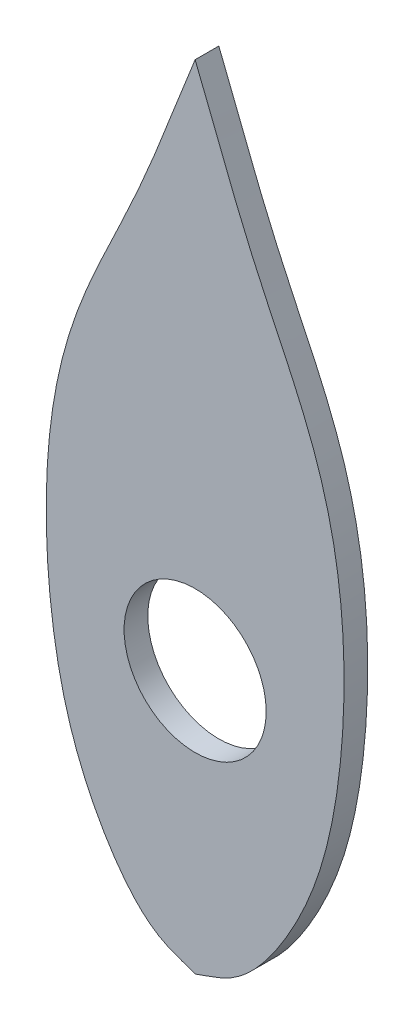
ISO-10303-21;
HEADER;
FILE_DESCRIPTION(('STEP AP214'),'2;1');
FILE_NAME('part.step','',(''),(''),'','','');
FILE_SCHEMA(('AUTOMOTIVE_DESIGN { 1 0 10303 214 1 1 1 1 }'));
ENDSEC;
DATA;
#1=APPLICATION_CONTEXT('core data for automotive mechanical design processes');
#2=APPLICATION_PROTOCOL_DEFINITION('international standard','automotive_design',2000,#1);
#3=PRODUCT_CONTEXT('',#1,'mechanical');
#4=PRODUCT('Part','Part','',(#3));
#5=PRODUCT_RELATED_PRODUCT_CATEGORY('part','',(#4));
#6=PRODUCT_DEFINITION_FORMATION('','',#4);
#7=PRODUCT_DEFINITION_CONTEXT('part definition',#1,'design');
#8=PRODUCT_DEFINITION('design','',#6,#7);
#9=PRODUCT_DEFINITION_SHAPE('','',#8);
#10=(LENGTH_UNIT() NAMED_UNIT(*) SI_UNIT(.MILLI.,.METRE.));
#11=(NAMED_UNIT(*) PLANE_ANGLE_UNIT() SI_UNIT($,.RADIAN.));
#12=(NAMED_UNIT(*) SI_UNIT($,.STERADIAN.) SOLID_ANGLE_UNIT());
#13=UNCERTAINTY_MEASURE_WITH_UNIT(LENGTH_MEASURE(1.E-05),#10,'distance_accuracy_value','');
#14=(GEOMETRIC_REPRESENTATION_CONTEXT(3) GLOBAL_UNCERTAINTY_ASSIGNED_CONTEXT((#13)) GLOBAL_UNIT_ASSIGNED_CONTEXT((#10,
#11,#12)) REPRESENTATION_CONTEXT('',''));
#15=CARTESIAN_POINT('',(0.,0.,0.));
#16=DIRECTION('',(0.,0.,1.));
#17=DIRECTION('',(1.,0.,0.));
#18=AXIS2_PLACEMENT_3D('',#15,#16,#17);
#19=CARTESIAN_POINT('',(-3.12105896682624E-11,-593.779675509223,10.));
#20=DIRECTION('',(0.,0.,-1.));
#21=DIRECTION('',(0.,-1.,0.));
#22=AXIS2_PLACEMENT_3D('',#19,#20,#21);
#23=PLANE('',#22);
#24=CARTESIAN_POINT('',(-3.19055892816778E-11,-650.,10.));
#25=DIRECTION('',(0.,0.,1.));
#26=DIRECTION('',(-1.,0.,0.));
#27=AXIS2_PLACEMENT_3D('',#24,#25,#26);
#28=CIRCLE('',#27,30.);
#29=CARTESIAN_POINT('',(29.9999999999681,-650.,10.));
#30=VERTEX_POINT('',#29);
#31=EDGE_CURVE('E72',#30,#30,#28,.T.);
#32=ORIENTED_EDGE('',*,*,#31,.F.);
#33=EDGE_LOOP('',(#32));
#34=FACE_BOUND('',#33,.T.);
#35=CARTESIAN_POINT('',(-1.40588803654307E-07,-760.98778889987,10.));
#36=CARTESIAN_POINT('',(-0.966428617349917,-760.596754521221,10.));
#37=CARTESIAN_POINT('',(-2.9595543216406,-759.842382588596,10.));
#38=CARTESIAN_POINT('',(-6.13005801264985,-758.793210794153,10.));
#39=CARTESIAN_POINT('',(-10.6971958915772,-757.312295774786,10.));
#40=CARTESIAN_POINT('',(-16.831572417391,-754.194954013794,10.));
#41=CARTESIAN_POINT('',(-23.1840752548707,-749.067385088242,10.));
#42=CARTESIAN_POINT('',(-29.5068809526564,-742.010834799348,10.));
#43=CARTESIAN_POINT('',(-35.5524505633351,-733.489808108575,10.));
#44=CARTESIAN_POINT('',(-41.1080477773042,-724.117890634938,10.));
#45=CARTESIAN_POINT('',(-46.0397533498983,-714.302934333428,10.));
#46=CARTESIAN_POINT('',(-50.3115334030834,-704.069190576016,10.));
#47=CARTESIAN_POINT('',(-53.942913343472,-693.230694043278,10.));
#48=CARTESIAN_POINT('',(-56.9779840956956,-681.502168977488,10.));
#49=CARTESIAN_POINT('',(-59.4521751140455,-668.627482758411,10.));
#50=CARTESIAN_POINT('',(-61.3557028658996,-654.515340666019,10.));
#51=CARTESIAN_POINT('',(-62.6120292134,-639.327683800956,10.));
#52=CARTESIAN_POINT('',(-63.1107434039999,-623.387395832126,10.));
#53=CARTESIAN_POINT('',(-62.731665069665,-607.11672930678,10.));
#54=CARTESIAN_POINT('',(-61.3717004107161,-590.966087951694,10.));
#55=CARTESIAN_POINT('',(-58.9724538652112,-575.344213615548,10.));
#56=CARTESIAN_POINT('',(-55.5440954244184,-560.55506415955,10.));
#57=CARTESIAN_POINT('',(-51.201287070304,-546.712487176007,10.));
#58=CARTESIAN_POINT('',(-46.1531432358476,-533.74243044551,10.));
#59=CARTESIAN_POINT('',(-40.6560682903646,-521.455562551203,10.));
#60=CARTESIAN_POINT('',(-34.9787240720144,-509.597438328137,10.));
#61=CARTESIAN_POINT('',(-29.3603126640434,-497.909563538984,10.));
#62=CARTESIAN_POINT('',(-23.9762489724472,-486.179859167975,10.));
#63=CARTESIAN_POINT('',(-18.8887120747706,-474.31203069045,10.));
#64=CARTESIAN_POINT('',(-14.0559159304529,-462.322446925781,10.));
#65=CARTESIAN_POINT('',(-9.37904065307944,-450.290769139399,10.));
#66=CARTESIAN_POINT('',(-5.66569205569597,-440.71812842161,10.));
#67=CARTESIAN_POINT('',(-2.85021644877616,-433.61131852361,10.));
#68=CARTESIAN_POINT('',(-0.953380409975259,-428.911762030197,10.));
#69=CARTESIAN_POINT('',(0.,-426.571562118576,10.));
#70=(BOUNDED_CURVE() B_SPLINE_CURVE(5,(#35,#36,#37,#38,#39,#40,#41,#42,#43,#44,#45,#46,#47,#48,
#49,#50,#51,#52,#53,#54,#55,#56,#57,#58,#59,#60,#61,#62,#63,#64,#65,#66,#67,#68,#69),
.UNSPECIFIED.,.F.,.F.) B_SPLINE_CURVE_WITH_KNOTS((6,1,1,1,1,1,1,1,1,1,1,1,1,1,1,1,1,1,1,1,1,1,1,
1,1,1,1,1,1,1,6),(0.,0.0333333333333333,0.0666666666666667,0.1,0.133333333333333,
0.166666666666667,0.2,0.233333333333333,0.266666666666667,0.3,0.333333333333333,
0.366666666666667,0.4,0.433333333333333,0.466666666666667,0.5,0.533333333333333,
0.566666666666667,0.6,0.633333333333333,0.666666666666667,0.7,0.733333333333333,
0.766666666666667,0.8,0.833333333333333,0.866666666666667,0.9,0.933333333333333,
0.966666666666667,1.),
.UNSPECIFIED.) CURVE() GEOMETRIC_REPRESENTATION_ITEM() RATIONAL_B_SPLINE_CURVE((1.,1.,1.,1.,1.,
1.,1.,1.,1.,1.,1.,1.,1.,1.,1.,1.,1.,1.,1.,1.,1.,1.,1.,1.,1.,1.,1.,1.,1.,1.,1.,1.,1.,1.,1.)) REPRESENTATION_ITEM(''));
#71=CARTESIAN_POINT('',(1.40512758332E-07,-760.98778889987,10.));
#72=VERTEX_POINT('',#71);
#73=CARTESIAN_POINT('',(-3.91405932920263E-11,-426.571562118576,10.));
#74=VERTEX_POINT('',#73);
#75=EDGE_CURVE('E26',#72,#74,#70,.T.);
#76=ORIENTED_EDGE('',*,*,#75,.F.);
#77=CARTESIAN_POINT('',(1.40512758332E-07,-760.98778889987,10.));
#78=CARTESIAN_POINT('',(0.966428617273915,-760.596754521221,10.));
#79=CARTESIAN_POINT('',(2.95955432156468,-759.842382588596,10.));
#80=CARTESIAN_POINT('',(6.13005801257407,-758.793210794153,10.));
#81=CARTESIAN_POINT('',(10.6971958915016,-757.312295774787,10.));
#82=CARTESIAN_POINT('',(16.8315724173157,-754.194954013796,10.));
#83=CARTESIAN_POINT('',(23.1840752547959,-749.067385088245,10.));
#84=CARTESIAN_POINT('',(29.5068809525822,-742.010834799352,10.));
#85=CARTESIAN_POINT('',(35.5524505632619,-733.489808108578,10.));
#86=CARTESIAN_POINT('',(41.1080477772322,-724.117890634943,10.));
#87=CARTESIAN_POINT('',(46.0397533498277,-714.302934333437,10.));
#88=CARTESIAN_POINT('',(50.3115334030142,-704.06919057603,10.));
#89=CARTESIAN_POINT('',(53.9429133434041,-693.230694043294,10.));
#90=CARTESIAN_POINT('',(56.9779840956288,-681.5021689775,10.));
#91=CARTESIAN_POINT('',(59.4521751139795,-668.627482758417,10.));
#92=CARTESIAN_POINT('',(61.3557028658346,-654.515340666015,10.));
#93=CARTESIAN_POINT('',(62.6120292133359,-639.327683800945,10.));
#94=CARTESIAN_POINT('',(63.1107434039374,-623.387395832112,10.));
#95=CARTESIAN_POINT('',(62.7316650696045,-607.116729306769,10.));
#96=CARTESIAN_POINT('',(61.3717004106578,-590.966087951689,10.));
#97=CARTESIAN_POINT('',(58.9724538651553,-575.344213615551,10.));
#98=CARTESIAN_POINT('',(55.5440954243649,-560.555064159561,10.));
#99=CARTESIAN_POINT('',(51.2012870702526,-546.712487176024,10.));
#100=CARTESIAN_POINT('',(46.1531432357981,-533.742430445531,10.));
#101=CARTESIAN_POINT('',(40.6560682903164,-521.455562551222,10.));
#102=CARTESIAN_POINT('',(34.978724071967,-509.59743832815,10.));
#103=CARTESIAN_POINT('',(29.3603126639966,-497.909563538989,10.));
#104=CARTESIAN_POINT('',(23.9762489724011,-486.179859167973,10.));
#105=CARTESIAN_POINT('',(18.8887120747255,-474.312030690446,10.));
#106=CARTESIAN_POINT('',(14.0559159304092,-462.322446925777,10.));
#107=CARTESIAN_POINT('',(9.37904065303729,-450.290769139397,10.));
#108=CARTESIAN_POINT('',(5.66569205565513,-440.71812842161,10.));
#109=CARTESIAN_POINT('',(2.85021644873622,-433.61131852361,10.));
#110=CARTESIAN_POINT('',(0.953380409935859,-428.911762030197,10.));
#111=CARTESIAN_POINT('',(-3.91405932920263E-11,-426.571562118576,10.));
#112=(BOUNDED_CURVE() B_SPLINE_CURVE(5,(#77,#78,#79,#80,#81,#82,#83,#84,#85,#86,#87,#88,#89,#90,
#91,#92,#93,#94,#95,#96,#97,#98,#99,#100,#101,#102,#103,#104,#105,#106,#107,#108,#109,#110,
#111),.UNSPECIFIED.,.F.,.F.) B_SPLINE_CURVE_WITH_KNOTS((6,1,1,1,1,1,1,1,1,1,1,1,1,1,1,1,1,1,1,1,
1,1,1,1,1,1,1,1,1,1,6),(0.,0.0333333333333333,0.0666666666666667,0.1,0.133333333333333,
0.166666666666667,0.2,0.233333333333333,0.266666666666667,0.3,0.333333333333333,
0.366666666666667,0.4,0.433333333333333,0.466666666666667,0.5,0.533333333333333,
0.566666666666667,0.6,0.633333333333333,0.666666666666667,0.7,0.733333333333333,
0.766666666666667,0.8,0.833333333333333,0.866666666666667,0.9,0.933333333333333,
0.966666666666667,1.),
.UNSPECIFIED.) CURVE() GEOMETRIC_REPRESENTATION_ITEM() RATIONAL_B_SPLINE_CURVE((1.,1.,1.,1.,1.,
1.,1.,1.,1.,1.,1.,1.,1.,1.,1.,1.,1.,1.,1.,1.,1.,1.,1.,1.,1.,1.,1.,1.,1.,1.,1.,1.,1.,1.,1.)) REPRESENTATION_ITEM(''));
#113=EDGE_CURVE('E57',#72,#74,#112,.T.);
#114=ORIENTED_EDGE('',*,*,#113,.T.);
#115=EDGE_LOOP('',(#76,#114));
#116=FACE_BOUND('',#115,.T.);
#117=ADVANCED_FACE('F15',(#34,#116),#23,.F.);
#118=CARTESIAN_POINT('',(-3.12105896682624E-11,-593.779675509223,0.));
#119=DIRECTION('',(0.,0.,-1.));
#120=DIRECTION('',(0.,-1.,0.));
#121=AXIS2_PLACEMENT_3D('',#118,#119,#120);
#122=PLANE('',#121);
#123=CARTESIAN_POINT('',(-3.19055892816778E-11,-650.,0.));
#124=DIRECTION('',(0.,0.,1.));
#125=DIRECTION('',(-1.,0.,0.));
#126=AXIS2_PLACEMENT_3D('',#123,#124,#125);
#127=CIRCLE('',#126,30.);
#128=CARTESIAN_POINT('',(29.9999999999681,-650.,0.));
#129=VERTEX_POINT('',#128);
#130=EDGE_CURVE('E97',#129,#129,#127,.T.);
#131=ORIENTED_EDGE('',*,*,#130,.T.);
#132=EDGE_LOOP('',(#131));
#133=FACE_BOUND('',#132,.T.);
#134=CARTESIAN_POINT('',(-1.40588803654307E-07,-760.98778889987,0.));
#135=CARTESIAN_POINT('',(-0.966428617349917,-760.596754521221,0.));
#136=CARTESIAN_POINT('',(-2.9595543216406,-759.842382588596,0.));
#137=CARTESIAN_POINT('',(-6.13005801264985,-758.793210794153,0.));
#138=CARTESIAN_POINT('',(-10.6971958915772,-757.312295774786,0.));
#139=CARTESIAN_POINT('',(-16.831572417391,-754.194954013794,0.));
#140=CARTESIAN_POINT('',(-23.1840752548707,-749.067385088242,0.));
#141=CARTESIAN_POINT('',(-29.5068809526564,-742.010834799348,0.));
#142=CARTESIAN_POINT('',(-35.5524505633351,-733.489808108575,0.));
#143=CARTESIAN_POINT('',(-41.1080477773042,-724.117890634938,0.));
#144=CARTESIAN_POINT('',(-46.0397533498983,-714.302934333428,0.));
#145=CARTESIAN_POINT('',(-50.3115334030834,-704.069190576016,0.));
#146=CARTESIAN_POINT('',(-53.942913343472,-693.230694043278,0.));
#147=CARTESIAN_POINT('',(-56.9779840956956,-681.502168977488,0.));
#148=CARTESIAN_POINT('',(-59.4521751140455,-668.627482758411,0.));
#149=CARTESIAN_POINT('',(-61.3557028658996,-654.515340666019,0.));
#150=CARTESIAN_POINT('',(-62.6120292134,-639.327683800956,0.));
#151=CARTESIAN_POINT('',(-63.1107434039999,-623.387395832126,0.));
#152=CARTESIAN_POINT('',(-62.731665069665,-607.11672930678,0.));
#153=CARTESIAN_POINT('',(-61.3717004107161,-590.966087951694,0.));
#154=CARTESIAN_POINT('',(-58.9724538652112,-575.344213615548,0.));
#155=CARTESIAN_POINT('',(-55.5440954244184,-560.55506415955,0.));
#156=CARTESIAN_POINT('',(-51.201287070304,-546.712487176007,0.));
#157=CARTESIAN_POINT('',(-46.1531432358476,-533.74243044551,0.));
#158=CARTESIAN_POINT('',(-40.6560682903646,-521.455562551203,0.));
#159=CARTESIAN_POINT('',(-34.9787240720144,-509.597438328137,0.));
#160=CARTESIAN_POINT('',(-29.3603126640434,-497.909563538984,0.));
#161=CARTESIAN_POINT('',(-23.9762489724472,-486.179859167975,0.));
#162=CARTESIAN_POINT('',(-18.8887120747706,-474.31203069045,0.));
#163=CARTESIAN_POINT('',(-14.0559159304529,-462.322446925781,0.));
#164=CARTESIAN_POINT('',(-9.37904065307944,-450.290769139399,0.));
#165=CARTESIAN_POINT('',(-5.66569205569597,-440.71812842161,0.));
#166=CARTESIAN_POINT('',(-2.85021644877616,-433.61131852361,0.));
#167=CARTESIAN_POINT('',(-0.953380409975259,-428.911762030197,0.));
#168=CARTESIAN_POINT('',(0.,-426.571562118576,0.));
#169=(BOUNDED_CURVE() B_SPLINE_CURVE(5,(#134,#135,#136,#137,#138,#139,#140,#141,#142,#143,#144,
#145,#146,#147,#148,#149,#150,#151,#152,#153,#154,#155,#156,#157,#158,#159,#160,#161,#162,#163,
#164,#165,#166,#167,#168),.UNSPECIFIED.,.F.,.F.) B_SPLINE_CURVE_WITH_KNOTS((6,1,1,1,1,1,1,1,1,1,
1,1,1,1,1,1,1,1,1,1,1,1,1,1,1,1,1,1,1,1,6),(0.,0.0333333333333333,0.0666666666666667,0.1,
0.133333333333333,0.166666666666667,0.2,0.233333333333333,0.266666666666667,0.3,
0.333333333333333,0.366666666666667,0.4,0.433333333333333,0.466666666666667,0.5,
0.533333333333333,0.566666666666667,0.6,0.633333333333333,0.666666666666667,0.7,
0.733333333333333,0.766666666666667,0.8,0.833333333333333,0.866666666666667,0.9,
0.933333333333333,0.966666666666667,1.),
.UNSPECIFIED.) CURVE() GEOMETRIC_REPRESENTATION_ITEM() RATIONAL_B_SPLINE_CURVE((1.,1.,1.,1.,1.,
1.,1.,1.,1.,1.,1.,1.,1.,1.,1.,1.,1.,1.,1.,1.,1.,1.,1.,1.,1.,1.,1.,1.,1.,1.,1.,1.,1.,1.,1.)) REPRESENTATION_ITEM(''));
#170=CARTESIAN_POINT('',(1.40512756985345E-07,-760.98778889987,0.));
#171=VERTEX_POINT('',#170);
#172=CARTESIAN_POINT('',(-3.91420229561845E-11,-426.571562118576,0.));
#173=VERTEX_POINT('',#172);
#174=EDGE_CURVE('E10',#171,#173,#169,.T.);
#175=ORIENTED_EDGE('',*,*,#174,.T.);
#176=CARTESIAN_POINT('',(-3.91405932920263E-11,-426.571562118576,0.));
#177=CARTESIAN_POINT('',(0.953380409935859,-428.911762030197,0.));
#178=CARTESIAN_POINT('',(2.85021644873622,-433.61131852361,0.));
#179=CARTESIAN_POINT('',(5.66569205565513,-440.71812842161,0.));
#180=CARTESIAN_POINT('',(9.37904065303729,-450.290769139397,0.));
#181=CARTESIAN_POINT('',(14.0559159304092,-462.322446925777,0.));
#182=CARTESIAN_POINT('',(18.8887120747255,-474.312030690446,0.));
#183=CARTESIAN_POINT('',(23.9762489724011,-486.179859167973,0.));
#184=CARTESIAN_POINT('',(29.3603126639966,-497.909563538989,0.));
#185=CARTESIAN_POINT('',(34.978724071967,-509.59743832815,0.));
#186=CARTESIAN_POINT('',(40.6560682903164,-521.455562551222,0.));
#187=CARTESIAN_POINT('',(46.1531432357981,-533.742430445531,0.));
#188=CARTESIAN_POINT('',(51.2012870702526,-546.712487176024,0.));
#189=CARTESIAN_POINT('',(55.5440954243649,-560.555064159561,0.));
#190=CARTESIAN_POINT('',(58.9724538651553,-575.344213615551,0.));
#191=CARTESIAN_POINT('',(61.3717004106578,-590.966087951689,0.));
#192=CARTESIAN_POINT('',(62.7316650696045,-607.116729306769,0.));
#193=CARTESIAN_POINT('',(63.1107434039374,-623.387395832112,0.));
#194=CARTESIAN_POINT('',(62.6120292133359,-639.327683800945,0.));
#195=CARTESIAN_POINT('',(61.3557028658346,-654.515340666015,0.));
#196=CARTESIAN_POINT('',(59.4521751139795,-668.627482758417,0.));
#197=CARTESIAN_POINT('',(56.9779840956288,-681.5021689775,0.));
#198=CARTESIAN_POINT('',(53.9429133434041,-693.230694043294,0.));
#199=CARTESIAN_POINT('',(50.3115334030142,-704.06919057603,0.));
#200=CARTESIAN_POINT('',(46.0397533498277,-714.302934333437,0.));
#201=CARTESIAN_POINT('',(41.1080477772322,-724.117890634943,0.));
#202=CARTESIAN_POINT('',(35.5524505632619,-733.489808108578,0.));
#203=CARTESIAN_POINT('',(29.5068809525822,-742.010834799352,0.));
#204=CARTESIAN_POINT('',(23.1840752547959,-749.067385088245,0.));
#205=CARTESIAN_POINT('',(16.8315724173157,-754.194954013796,0.));
#206=CARTESIAN_POINT('',(10.6971958915016,-757.312295774787,0.));
#207=CARTESIAN_POINT('',(6.13005801257407,-758.793210794153,0.));
#208=CARTESIAN_POINT('',(2.95955432156468,-759.842382588596,0.));
#209=CARTESIAN_POINT('',(0.966428617273915,-760.596754521221,0.));
#210=CARTESIAN_POINT('',(1.40512758332E-07,-760.98778889987,0.));
#211=(BOUNDED_CURVE() B_SPLINE_CURVE(5,(#176,#177,#178,#179,#180,#181,#182,#183,#184,#185,#186,
#187,#188,#189,#190,#191,#192,#193,#194,#195,#196,#197,#198,#199,#200,#201,#202,#203,#204,#205,
#206,#207,#208,#209,#210),.UNSPECIFIED.,.F.,.F.) B_SPLINE_CURVE_WITH_KNOTS((6,1,1,1,1,1,1,1,1,1,
1,1,1,1,1,1,1,1,1,1,1,1,1,1,1,1,1,1,1,1,6),(-1.,-0.966666666666667,-0.933333333333333,-0.9,
-0.866666666666667,-0.833333333333333,-0.8,-0.766666666666667,-0.733333333333333,-0.7,
-0.666666666666667,-0.633333333333333,-0.6,-0.566666666666667,-0.533333333333333,-0.5,
-0.466666666666667,-0.433333333333333,-0.4,-0.366666666666667,-0.333333333333333,-0.3,
-0.266666666666667,-0.233333333333333,-0.2,-0.166666666666667,-0.133333333333333,-0.1,
-0.0666666666666667,-0.0333333333333333,0.),
.UNSPECIFIED.) CURVE() GEOMETRIC_REPRESENTATION_ITEM() RATIONAL_B_SPLINE_CURVE((1.,1.,1.,1.,1.,
1.,1.,1.,1.,1.,1.,1.,1.,1.,1.,1.,1.,1.,1.,1.,1.,1.,1.,1.,1.,1.,1.,1.,1.,1.,1.,1.,1.,1.,1.)) REPRESENTATION_ITEM(''));
#212=EDGE_CURVE('E68',#173,#171,#211,.T.);
#213=ORIENTED_EDGE('',*,*,#212,.T.);
#214=EDGE_LOOP('',(#175,#213));
#215=FACE_BOUND('',#214,.T.);
#216=ADVANCED_FACE('F112',(#133,#215),#122,.T.);
#217=CARTESIAN_POINT('',(-1.40588803654307E-07,-760.98778889987,10.));
#218=CARTESIAN_POINT('',(-1.40588803654307E-07,-760.98778889987,0.));
#219=CARTESIAN_POINT('',(-0.966428617349917,-760.596754521221,10.));
#220=CARTESIAN_POINT('',(-0.966428617349917,-760.596754521221,0.));
#221=CARTESIAN_POINT('',(-2.9595543216406,-759.842382588596,10.));
#222=CARTESIAN_POINT('',(-2.9595543216406,-759.842382588596,0.));
#223=CARTESIAN_POINT('',(-6.13005801264985,-758.793210794153,10.));
#224=CARTESIAN_POINT('',(-6.13005801264985,-758.793210794153,0.));
#225=CARTESIAN_POINT('',(-10.6971958915772,-757.312295774786,10.));
#226=CARTESIAN_POINT('',(-10.6971958915772,-757.312295774786,0.));
#227=CARTESIAN_POINT('',(-16.831572417391,-754.194954013794,10.));
#228=CARTESIAN_POINT('',(-16.831572417391,-754.194954013794,0.));
#229=CARTESIAN_POINT('',(-23.1840752548707,-749.067385088242,10.));
#230=CARTESIAN_POINT('',(-23.1840752548707,-749.067385088242,0.));
#231=CARTESIAN_POINT('',(-29.5068809526564,-742.010834799348,10.));
#232=CARTESIAN_POINT('',(-29.5068809526564,-742.010834799348,0.));
#233=CARTESIAN_POINT('',(-35.5524505633351,-733.489808108575,10.));
#234=CARTESIAN_POINT('',(-35.5524505633351,-733.489808108575,0.));
#235=CARTESIAN_POINT('',(-41.1080477773042,-724.117890634938,10.));
#236=CARTESIAN_POINT('',(-41.1080477773042,-724.117890634938,0.));
#237=CARTESIAN_POINT('',(-46.0397533498983,-714.302934333428,10.));
#238=CARTESIAN_POINT('',(-46.0397533498983,-714.302934333428,0.));
#239=CARTESIAN_POINT('',(-50.3115334030834,-704.069190576016,10.));
#240=CARTESIAN_POINT('',(-50.3115334030834,-704.069190576016,0.));
#241=CARTESIAN_POINT('',(-53.942913343472,-693.230694043278,10.));
#242=CARTESIAN_POINT('',(-53.942913343472,-693.230694043278,0.));
#243=CARTESIAN_POINT('',(-56.9779840956956,-681.502168977488,10.));
#244=CARTESIAN_POINT('',(-56.9779840956956,-681.502168977488,0.));
#245=CARTESIAN_POINT('',(-59.4521751140455,-668.627482758411,10.));
#246=CARTESIAN_POINT('',(-59.4521751140455,-668.627482758411,0.));
#247=CARTESIAN_POINT('',(-61.3557028658996,-654.515340666019,10.));
#248=CARTESIAN_POINT('',(-61.3557028658996,-654.515340666019,0.));
#249=CARTESIAN_POINT('',(-62.6120292134,-639.327683800956,10.));
#250=CARTESIAN_POINT('',(-62.6120292134,-639.327683800956,0.));
#251=CARTESIAN_POINT('',(-63.1107434039999,-623.387395832126,10.));
#252=CARTESIAN_POINT('',(-63.1107434039999,-623.387395832126,0.));
#253=CARTESIAN_POINT('',(-62.731665069665,-607.11672930678,10.));
#254=CARTESIAN_POINT('',(-62.731665069665,-607.11672930678,0.));
#255=CARTESIAN_POINT('',(-61.3717004107161,-590.966087951694,10.));
#256=CARTESIAN_POINT('',(-61.3717004107161,-590.966087951694,0.));
#257=CARTESIAN_POINT('',(-58.9724538652112,-575.344213615548,10.));
#258=CARTESIAN_POINT('',(-58.9724538652112,-575.344213615548,0.));
#259=CARTESIAN_POINT('',(-55.5440954244184,-560.55506415955,10.));
#260=CARTESIAN_POINT('',(-55.5440954244184,-560.55506415955,0.));
#261=CARTESIAN_POINT('',(-51.201287070304,-546.712487176007,10.));
#262=CARTESIAN_POINT('',(-51.201287070304,-546.712487176007,0.));
#263=CARTESIAN_POINT('',(-46.1531432358476,-533.74243044551,10.));
#264=CARTESIAN_POINT('',(-46.1531432358476,-533.74243044551,0.));
#265=CARTESIAN_POINT('',(-40.6560682903646,-521.455562551203,10.));
#266=CARTESIAN_POINT('',(-40.6560682903646,-521.455562551203,0.));
#267=CARTESIAN_POINT('',(-34.9787240720144,-509.597438328137,10.));
#268=CARTESIAN_POINT('',(-34.9787240720144,-509.597438328137,0.));
#269=CARTESIAN_POINT('',(-29.3603126640434,-497.909563538984,10.));
#270=CARTESIAN_POINT('',(-29.3603126640434,-497.909563538984,0.));
#271=CARTESIAN_POINT('',(-23.9762489724472,-486.179859167975,10.));
#272=CARTESIAN_POINT('',(-23.9762489724472,-486.179859167975,0.));
#273=CARTESIAN_POINT('',(-18.8887120747706,-474.31203069045,10.));
#274=CARTESIAN_POINT('',(-18.8887120747706,-474.31203069045,0.));
#275=CARTESIAN_POINT('',(-14.0559159304529,-462.322446925781,10.));
#276=CARTESIAN_POINT('',(-14.0559159304529,-462.322446925781,0.));
#277=CARTESIAN_POINT('',(-9.37904065307944,-450.290769139399,10.));
#278=CARTESIAN_POINT('',(-9.37904065307944,-450.290769139399,0.));
#279=CARTESIAN_POINT('',(-5.66569205569597,-440.71812842161,10.));
#280=CARTESIAN_POINT('',(-5.66569205569597,-440.71812842161,0.));
#281=CARTESIAN_POINT('',(-2.85021644877616,-433.61131852361,10.));
#282=CARTESIAN_POINT('',(-2.85021644877616,-433.61131852361,0.));
#283=CARTESIAN_POINT('',(-0.953380409975259,-428.911762030197,10.));
#284=CARTESIAN_POINT('',(-0.953380409975259,-428.911762030197,0.));
#285=CARTESIAN_POINT('',(0.,-426.571562118576,10.));
#286=CARTESIAN_POINT('',(0.,-426.571562118576,0.));
#287=(BOUNDED_SURFACE() B_SPLINE_SURFACE(5,1,((#217,#218),(#219,#220),(#221,#222),(#223,#224),
(#225,#226),(#227,#228),(#229,#230),(#231,#232),(#233,#234),(#235,#236),(#237,#238),(#239,#240),
(#241,#242),(#243,#244),(#245,#246),(#247,#248),(#249,#250),(#251,#252),(#253,#254),(#255,#256),
(#257,#258),(#259,#260),(#261,#262),(#263,#264),(#265,#266),(#267,#268),(#269,#270),(#271,#272),
(#273,#274),(#275,#276),(#277,#278),(#279,#280),(#281,#282),(#283,#284),(#285,#286)),
.UNSPECIFIED.,.F.,.F.,.F.) B_SPLINE_SURFACE_WITH_KNOTS((6,1,1,1,1,1,1,1,1,1,1,1,1,1,1,1,1,1,1,1,
1,1,1,1,1,1,1,1,1,1,6),(2,2),(0.,0.0333333333333333,0.0666666666666667,0.1,0.133333333333333,
0.166666666666667,0.2,0.233333333333333,0.266666666666667,0.3,0.333333333333333,
0.366666666666667,0.4,0.433333333333333,0.466666666666667,0.5,0.533333333333333,
0.566666666666667,0.6,0.633333333333333,0.666666666666667,0.7,0.733333333333333,
0.766666666666667,0.8,0.833333333333333,0.866666666666667,0.9,0.933333333333333,
0.966666666666667,1.),(0.,1.),
.UNSPECIFIED.) GEOMETRIC_REPRESENTATION_ITEM() RATIONAL_B_SPLINE_SURFACE(((1.,1.),(1.,1.),(1.,
1.),(1.,1.),(1.,1.),(1.,1.),(1.,1.),(1.,1.),(1.,1.),(1.,1.),(1.,1.),(1.,1.),(1.,1.),(1.,1.),(1.,
1.),(1.,1.),(1.,1.),(1.,1.),(1.,1.),(1.,1.),(1.,1.),(1.,1.),(1.,1.),(1.,1.),(1.,1.),(1.,1.),(1.,
1.),(1.,1.),(1.,1.),(1.,1.),(1.,1.),(1.,1.),(1.,1.),(1.,1.),(1.,1.))) REPRESENTATION_ITEM('') SURFACE());
#288=DIRECTION('',(0.,0.,-1.));
#289=VECTOR('',#288,1.);
#290=CARTESIAN_POINT('',(-3.91405932920263E-11,-426.571562118576,10.));
#291=LINE('',#290,#289);
#292=EDGE_CURVE('E19',#74,#173,#291,.T.);
#293=DIRECTION('',(0.,0.,-1.));
#294=VECTOR('',#293,1.);
#295=CARTESIAN_POINT('',(1.40512758332E-07,-760.98778889987,10.));
#296=LINE('',#295,#294);
#297=EDGE_CURVE('E63',#72,#171,#296,.T.);
#298=ORIENTED_EDGE('',*,*,#75,.T.);
#299=ORIENTED_EDGE('',*,*,#292,.T.);
#300=ORIENTED_EDGE('',*,*,#174,.F.);
#301=ORIENTED_EDGE('',*,*,#297,.F.);
#302=EDGE_LOOP('',(#298,#299,#300,#301));
#303=FACE_BOUND('',#302,.T.);
#304=ADVANCED_FACE('F64',(#303),#287,.T.);
#305=CARTESIAN_POINT('',(-3.91405932920263E-11,-426.571562118576,10.));
#306=CARTESIAN_POINT('',(-3.91405932920263E-11,-426.571562118576,0.));
#307=CARTESIAN_POINT('',(0.953380409935859,-428.911762030197,10.));
#308=CARTESIAN_POINT('',(0.953380409935859,-428.911762030197,0.));
#309=CARTESIAN_POINT('',(2.85021644873622,-433.61131852361,10.));
#310=CARTESIAN_POINT('',(2.85021644873622,-433.61131852361,0.));
#311=CARTESIAN_POINT('',(5.66569205565513,-440.71812842161,10.));
#312=CARTESIAN_POINT('',(5.66569205565513,-440.71812842161,0.));
#313=CARTESIAN_POINT('',(9.37904065303729,-450.290769139397,10.));
#314=CARTESIAN_POINT('',(9.37904065303729,-450.290769139397,0.));
#315=CARTESIAN_POINT('',(14.0559159304092,-462.322446925777,10.));
#316=CARTESIAN_POINT('',(14.0559159304092,-462.322446925777,0.));
#317=CARTESIAN_POINT('',(18.8887120747255,-474.312030690446,10.));
#318=CARTESIAN_POINT('',(18.8887120747255,-474.312030690446,0.));
#319=CARTESIAN_POINT('',(23.9762489724011,-486.179859167973,10.));
#320=CARTESIAN_POINT('',(23.9762489724011,-486.179859167973,0.));
#321=CARTESIAN_POINT('',(29.3603126639966,-497.909563538989,10.));
#322=CARTESIAN_POINT('',(29.3603126639966,-497.909563538989,0.));
#323=CARTESIAN_POINT('',(34.978724071967,-509.59743832815,10.));
#324=CARTESIAN_POINT('',(34.978724071967,-509.59743832815,0.));
#325=CARTESIAN_POINT('',(40.6560682903164,-521.455562551222,10.));
#326=CARTESIAN_POINT('',(40.6560682903164,-521.455562551222,0.));
#327=CARTESIAN_POINT('',(46.1531432357981,-533.742430445531,10.));
#328=CARTESIAN_POINT('',(46.1531432357981,-533.742430445531,0.));
#329=CARTESIAN_POINT('',(51.2012870702526,-546.712487176024,10.));
#330=CARTESIAN_POINT('',(51.2012870702526,-546.712487176024,0.));
#331=CARTESIAN_POINT('',(55.5440954243649,-560.555064159561,10.));
#332=CARTESIAN_POINT('',(55.5440954243649,-560.555064159561,0.));
#333=CARTESIAN_POINT('',(58.9724538651553,-575.344213615551,10.));
#334=CARTESIAN_POINT('',(58.9724538651553,-575.344213615551,0.));
#335=CARTESIAN_POINT('',(61.3717004106578,-590.966087951689,10.));
#336=CARTESIAN_POINT('',(61.3717004106578,-590.966087951689,0.));
#337=CARTESIAN_POINT('',(62.7316650696045,-607.116729306769,10.));
#338=CARTESIAN_POINT('',(62.7316650696045,-607.116729306769,0.));
#339=CARTESIAN_POINT('',(63.1107434039374,-623.387395832112,10.));
#340=CARTESIAN_POINT('',(63.1107434039374,-623.387395832112,0.));
#341=CARTESIAN_POINT('',(62.6120292133359,-639.327683800945,10.));
#342=CARTESIAN_POINT('',(62.6120292133359,-639.327683800945,0.));
#343=CARTESIAN_POINT('',(61.3557028658346,-654.515340666015,10.));
#344=CARTESIAN_POINT('',(61.3557028658346,-654.515340666015,0.));
#345=CARTESIAN_POINT('',(59.4521751139795,-668.627482758417,10.));
#346=CARTESIAN_POINT('',(59.4521751139795,-668.627482758417,0.));
#347=CARTESIAN_POINT('',(56.9779840956288,-681.5021689775,10.));
#348=CARTESIAN_POINT('',(56.9779840956288,-681.5021689775,0.));
#349=CARTESIAN_POINT('',(53.9429133434041,-693.230694043294,10.));
#350=CARTESIAN_POINT('',(53.9429133434041,-693.230694043294,0.));
#351=CARTESIAN_POINT('',(50.3115334030142,-704.06919057603,10.));
#352=CARTESIAN_POINT('',(50.3115334030142,-704.06919057603,0.));
#353=CARTESIAN_POINT('',(46.0397533498277,-714.302934333437,10.));
#354=CARTESIAN_POINT('',(46.0397533498277,-714.302934333437,0.));
#355=CARTESIAN_POINT('',(41.1080477772322,-724.117890634943,10.));
#356=CARTESIAN_POINT('',(41.1080477772322,-724.117890634943,0.));
#357=CARTESIAN_POINT('',(35.5524505632619,-733.489808108578,10.));
#358=CARTESIAN_POINT('',(35.5524505632619,-733.489808108578,0.));
#359=CARTESIAN_POINT('',(29.5068809525822,-742.010834799352,10.));
#360=CARTESIAN_POINT('',(29.5068809525822,-742.010834799352,0.));
#361=CARTESIAN_POINT('',(23.1840752547959,-749.067385088245,10.));
#362=CARTESIAN_POINT('',(23.1840752547959,-749.067385088245,0.));
#363=CARTESIAN_POINT('',(16.8315724173157,-754.194954013796,10.));
#364=CARTESIAN_POINT('',(16.8315724173157,-754.194954013796,0.));
#365=CARTESIAN_POINT('',(10.6971958915016,-757.312295774787,10.));
#366=CARTESIAN_POINT('',(10.6971958915016,-757.312295774787,0.));
#367=CARTESIAN_POINT('',(6.13005801257407,-758.793210794153,10.));
#368=CARTESIAN_POINT('',(6.13005801257407,-758.793210794153,0.));
#369=CARTESIAN_POINT('',(2.95955432156468,-759.842382588596,10.));
#370=CARTESIAN_POINT('',(2.95955432156468,-759.842382588596,0.));
#371=CARTESIAN_POINT('',(0.966428617273914,-760.596754521221,10.));
#372=CARTESIAN_POINT('',(0.966428617273914,-760.596754521221,0.));
#373=CARTESIAN_POINT('',(1.40512758332E-07,-760.98778889987,10.));
#374=CARTESIAN_POINT('',(1.40512758332E-07,-760.98778889987,0.));
#375=(BOUNDED_SURFACE() B_SPLINE_SURFACE(5,1,((#305,#306),(#307,#308),(#309,#310),(#311,#312),
(#313,#314),(#315,#316),(#317,#318),(#319,#320),(#321,#322),(#323,#324),(#325,#326),(#327,#328),
(#329,#330),(#331,#332),(#333,#334),(#335,#336),(#337,#338),(#339,#340),(#341,#342),(#343,#344),
(#345,#346),(#347,#348),(#349,#350),(#351,#352),(#353,#354),(#355,#356),(#357,#358),(#359,#360),
(#361,#362),(#363,#364),(#365,#366),(#367,#368),(#369,#370),(#371,#372),(#373,#374)),
.UNSPECIFIED.,.F.,.F.,.F.) B_SPLINE_SURFACE_WITH_KNOTS((6,1,1,1,1,1,1,1,1,1,1,1,1,1,1,1,1,1,1,1,
1,1,1,1,1,1,1,1,1,1,6),(2,2),(-1.,-0.966666666666667,-0.933333333333333,-0.9,-0.866666666666667,
-0.833333333333333,-0.8,-0.766666666666667,-0.733333333333333,-0.7,-0.666666666666667,
-0.633333333333333,-0.6,-0.566666666666667,-0.533333333333333,-0.5,-0.466666666666667,
-0.433333333333333,-0.4,-0.366666666666667,-0.333333333333333,-0.3,-0.266666666666667,
-0.233333333333333,-0.2,-0.166666666666667,-0.133333333333333,-0.1,-0.0666666666666667,
-0.0333333333333333,0.),(0.,1.),
.UNSPECIFIED.) GEOMETRIC_REPRESENTATION_ITEM() RATIONAL_B_SPLINE_SURFACE(((1.,1.),(1.,1.),(1.,
1.),(1.,1.),(1.,1.),(1.,1.),(1.,1.),(1.,1.),(1.,1.),(1.,1.),(1.,1.),(1.,1.),(1.,1.),(1.,1.),(1.,
1.),(1.,1.),(1.,1.),(1.,1.),(1.,1.),(1.,1.),(1.,1.),(1.,1.),(1.,1.),(1.,1.),(1.,1.),(1.,1.),(1.,
1.),(1.,1.),(1.,1.),(1.,1.),(1.,1.),(1.,1.),(1.,1.),(1.,1.),(1.,1.))) REPRESENTATION_ITEM('') SURFACE());
#376=ORIENTED_EDGE('',*,*,#113,.F.);
#377=ORIENTED_EDGE('',*,*,#297,.T.);
#378=ORIENTED_EDGE('',*,*,#212,.F.);
#379=ORIENTED_EDGE('',*,*,#292,.F.);
#380=EDGE_LOOP('',(#376,#377,#378,#379));
#381=FACE_BOUND('',#380,.T.);
#382=ADVANCED_FACE('F70',(#381),#375,.T.);
#383=CARTESIAN_POINT('',(-3.19055892816778E-11,-650.,10.));
#384=DIRECTION('',(0.,0.,-1.));
#385=DIRECTION('',(-1.,0.,0.));
#386=AXIS2_PLACEMENT_3D('',#383,#384,#385);
#387=CYLINDRICAL_SURFACE('',#386,30.);
#388=ORIENTED_EDGE('',*,*,#130,.F.);
#389=DIRECTION('',(0.,0.,1.));
#390=VECTOR('',#389,1.);
#391=CARTESIAN_POINT('',(29.9999999999681,-650.,10.));
#392=LINE('',#391,#390);
#393=EDGE_CURVE('E78',#129,#30,#392,.T.);
#394=ORIENTED_EDGE('',*,*,#393,.T.);
#395=ORIENTED_EDGE('',*,*,#31,.T.);
#396=ORIENTED_EDGE('',*,*,#393,.F.);
#397=EDGE_LOOP('',(#388,#394,#395,#396));
#398=FACE_BOUND('',#397,.T.);
#399=ADVANCED_FACE('F17',(#398),#387,.F.);
#400=CLOSED_SHELL('',(#117,#216,#304,#382,#399));
#401=MANIFOLD_SOLID_BREP('B1',#400);
#402=ADVANCED_BREP_SHAPE_REPRESENTATION('',(#18,#401),#14);
#403=SHAPE_DEFINITION_REPRESENTATION(#9,#402);
ENDSEC;
END-ISO-10303-21;
